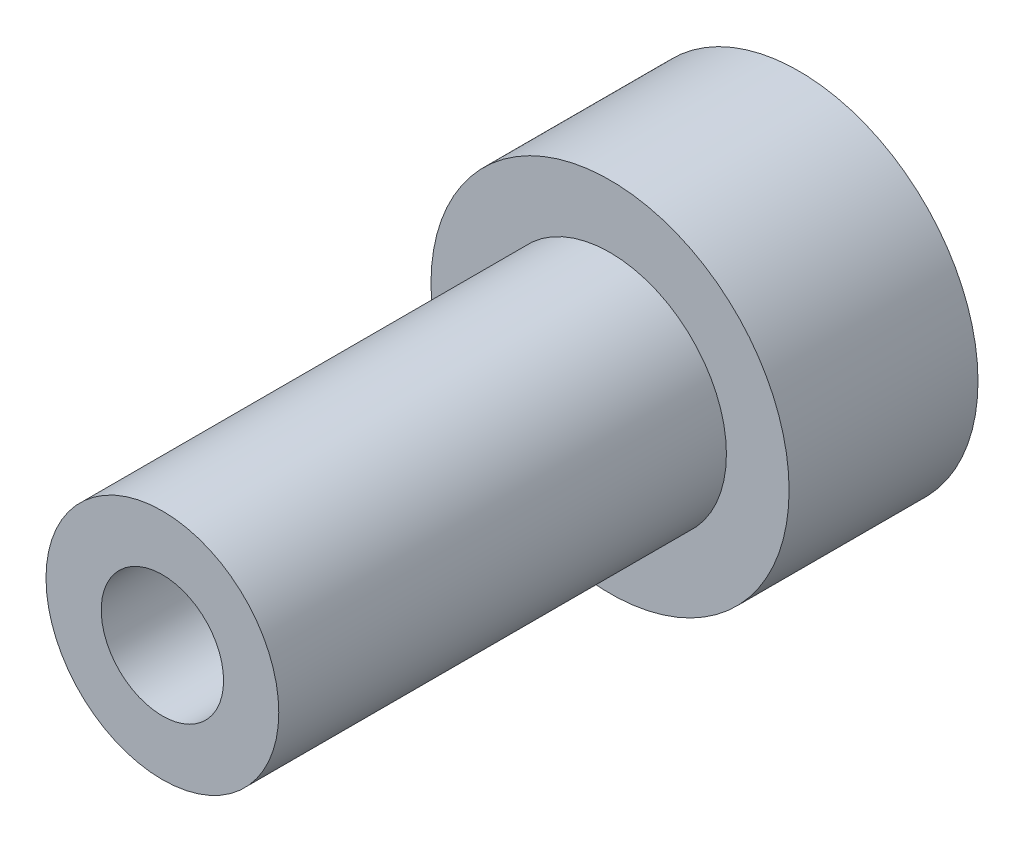
ISO-10303-21;
HEADER;
FILE_DESCRIPTION(('STEP AP214'),'2;1');
FILE_NAME('part.step','',(''),(''),'','','');
FILE_SCHEMA(('AUTOMOTIVE_DESIGN { 1 0 10303 214 1 1 1 1 }'));
ENDSEC;
DATA;
#1=APPLICATION_CONTEXT('core data for automotive mechanical design processes');
#2=APPLICATION_PROTOCOL_DEFINITION('international standard','automotive_design',2000,#1);
#3=PRODUCT_CONTEXT('',#1,'mechanical');
#4=PRODUCT('Part','Part','',(#3));
#5=PRODUCT_RELATED_PRODUCT_CATEGORY('part','',(#4));
#6=PRODUCT_DEFINITION_FORMATION('','',#4);
#7=PRODUCT_DEFINITION_CONTEXT('part definition',#1,'design');
#8=PRODUCT_DEFINITION('design','',#6,#7);
#9=PRODUCT_DEFINITION_SHAPE('','',#8);
#10=(LENGTH_UNIT() NAMED_UNIT(*) SI_UNIT(.MILLI.,.METRE.));
#11=(NAMED_UNIT(*) PLANE_ANGLE_UNIT() SI_UNIT($,.RADIAN.));
#12=(NAMED_UNIT(*) SI_UNIT($,.STERADIAN.) SOLID_ANGLE_UNIT());
#13=UNCERTAINTY_MEASURE_WITH_UNIT(LENGTH_MEASURE(1.E-05),#10,'distance_accuracy_value','');
#14=(GEOMETRIC_REPRESENTATION_CONTEXT(3) GLOBAL_UNCERTAINTY_ASSIGNED_CONTEXT((#13)) GLOBAL_UNIT_ASSIGNED_CONTEXT((#10,
#11,#12)) REPRESENTATION_CONTEXT('',''));
#15=CARTESIAN_POINT('',(0.,0.,0.));
#16=DIRECTION('',(0.,0.,1.));
#17=DIRECTION('',(1.,0.,0.));
#18=AXIS2_PLACEMENT_3D('',#15,#16,#17);
#19=CARTESIAN_POINT('',(0.,0.,6.33));
#20=DIRECTION('',(0.,0.,1.));
#21=DIRECTION('',(1.,0.,0.));
#22=AXIS2_PLACEMENT_3D('',#19,#20,#21);
#23=PLANE('',#22);
#24=CARTESIAN_POINT('',(0.,0.,6.33));
#25=DIRECTION('',(0.,0.,1.));
#26=DIRECTION('',(1.,0.,0.));
#27=AXIS2_PLACEMENT_3D('',#24,#25,#26);
#28=CIRCLE('',#27,6.);
#29=CARTESIAN_POINT('',(6.,0.,6.33));
#30=VERTEX_POINT('',#29);
#31=EDGE_CURVE('E10',#30,#30,#28,.T.);
#32=ORIENTED_EDGE('',*,*,#31,.T.);
#33=EDGE_LOOP('',(#32));
#34=FACE_BOUND('',#33,.T.);
#35=CARTESIAN_POINT('',(0.,0.,6.33));
#36=DIRECTION('',(0.,0.,1.));
#37=DIRECTION('',(1.,0.,0.));
#38=AXIS2_PLACEMENT_3D('',#35,#36,#37);
#39=CIRCLE('',#38,3.9);
#40=CARTESIAN_POINT('',(3.9,0.,6.33));
#41=VERTEX_POINT('',#40);
#42=EDGE_CURVE('E49',#41,#41,#39,.T.);
#43=ORIENTED_EDGE('',*,*,#42,.F.);
#44=EDGE_LOOP('',(#43));
#45=FACE_BOUND('',#44,.T.);
#46=ADVANCED_FACE('F33',(#34,#45),#23,.T.);
#47=CARTESIAN_POINT('',(0.,0.,0.));
#48=DIRECTION('',(0.,0.,1.));
#49=DIRECTION('',(1.,0.,0.));
#50=AXIS2_PLACEMENT_3D('',#47,#48,#49);
#51=PLANE('',#50);
#52=CARTESIAN_POINT('',(0.,0.,0.));
#53=DIRECTION('',(0.,0.,1.));
#54=DIRECTION('',(1.,0.,0.));
#55=AXIS2_PLACEMENT_3D('',#52,#53,#54);
#56=CIRCLE('',#55,6.);
#57=CARTESIAN_POINT('',(6.,0.,0.));
#58=VERTEX_POINT('',#57);
#59=EDGE_CURVE('E37',#58,#58,#56,.T.);
#60=ORIENTED_EDGE('',*,*,#59,.F.);
#61=EDGE_LOOP('',(#60));
#62=FACE_BOUND('',#61,.T.);
#63=CARTESIAN_POINT('',(0.,0.,0.));
#64=DIRECTION('',(0.,0.,1.));
#65=DIRECTION('',(1.,0.,0.));
#66=AXIS2_PLACEMENT_3D('',#63,#64,#65);
#67=CIRCLE('',#66,2.05);
#68=CARTESIAN_POINT('',(2.05,0.,0.));
#69=VERTEX_POINT('',#68);
#70=EDGE_CURVE('E44',#69,#69,#67,.T.);
#71=ORIENTED_EDGE('',*,*,#70,.T.);
#72=EDGE_LOOP('',(#71));
#73=FACE_BOUND('',#72,.T.);
#74=ADVANCED_FACE('F74',(#62,#73),#51,.F.);
#75=CARTESIAN_POINT('',(0.,0.,6.33));
#76=DIRECTION('',(0.,0.,-1.));
#77=DIRECTION('',(-1.,0.,0.));
#78=AXIS2_PLACEMENT_3D('',#75,#76,#77);
#79=CYLINDRICAL_SURFACE('',#78,6.);
#80=ORIENTED_EDGE('',*,*,#31,.F.);
#81=EDGE_LOOP('',(#80));
#82=FACE_BOUND('',#81,.T.);
#83=ORIENTED_EDGE('',*,*,#59,.T.);
#84=EDGE_LOOP('',(#83));
#85=FACE_BOUND('',#84,.T.);
#86=ADVANCED_FACE('F35',(#82,#85),#79,.T.);
#87=CARTESIAN_POINT('',(0.,0.,6.33));
#88=DIRECTION('',(0.,0.,-1.));
#89=DIRECTION('',(-1.,0.,0.));
#90=AXIS2_PLACEMENT_3D('',#87,#88,#89);
#91=CYLINDRICAL_SURFACE('',#90,2.05);
#92=ORIENTED_EDGE('',*,*,#70,.F.);
#93=EDGE_LOOP('',(#92));
#94=FACE_BOUND('',#93,.T.);
#95=CARTESIAN_POINT('',(0.,0.,21.33));
#96=DIRECTION('',(0.,0.,1.));
#97=DIRECTION('',(1.,0.,0.));
#98=AXIS2_PLACEMENT_3D('',#95,#96,#97);
#99=CIRCLE('',#98,2.05);
#100=CARTESIAN_POINT('',(2.05,0.,21.33));
#101=VERTEX_POINT('',#100);
#102=EDGE_CURVE('E52',#101,#101,#99,.T.);
#103=ORIENTED_EDGE('',*,*,#102,.T.);
#104=EDGE_LOOP('',(#103));
#105=FACE_BOUND('',#104,.T.);
#106=ADVANCED_FACE('F58',(#94,#105),#91,.F.);
#107=CARTESIAN_POINT('',(0.,0.,21.33));
#108=DIRECTION('',(0.,0.,1.));
#109=DIRECTION('',(1.,0.,0.));
#110=AXIS2_PLACEMENT_3D('',#107,#108,#109);
#111=PLANE('',#110);
#112=CARTESIAN_POINT('',(0.,0.,21.33));
#113=DIRECTION('',(0.,0.,1.));
#114=DIRECTION('',(1.,0.,0.));
#115=AXIS2_PLACEMENT_3D('',#112,#113,#114);
#116=CIRCLE('',#115,3.9);
#117=CARTESIAN_POINT('',(3.9,0.,21.33));
#118=VERTEX_POINT('',#117);
#119=EDGE_CURVE('E48',#118,#118,#116,.T.);
#120=ORIENTED_EDGE('',*,*,#119,.T.);
#121=EDGE_LOOP('',(#120));
#122=FACE_BOUND('',#121,.T.);
#123=ORIENTED_EDGE('',*,*,#102,.F.);
#124=EDGE_LOOP('',(#123));
#125=FACE_BOUND('',#124,.T.);
#126=ADVANCED_FACE('F60',(#122,#125),#111,.T.);
#127=CARTESIAN_POINT('',(0.,0.,21.33));
#128=DIRECTION('',(0.,0.,-1.));
#129=DIRECTION('',(-1.,0.,0.));
#130=AXIS2_PLACEMENT_3D('',#127,#128,#129);
#131=CYLINDRICAL_SURFACE('',#130,3.9);
#132=ORIENTED_EDGE('',*,*,#119,.F.);
#133=EDGE_LOOP('',(#132));
#134=FACE_BOUND('',#133,.T.);
#135=ORIENTED_EDGE('',*,*,#42,.T.);
#136=EDGE_LOOP('',(#135));
#137=FACE_BOUND('',#136,.T.);
#138=ADVANCED_FACE('F62',(#134,#137),#131,.T.);
#139=CLOSED_SHELL('',(#46,#74,#86,#106,#126,#138));
#140=MANIFOLD_SOLID_BREP('B2',#139);
#141=ADVANCED_BREP_SHAPE_REPRESENTATION('',(#18,#140),#14);
#142=SHAPE_DEFINITION_REPRESENTATION(#9,#141);
ENDSEC;
END-ISO-10303-21;
